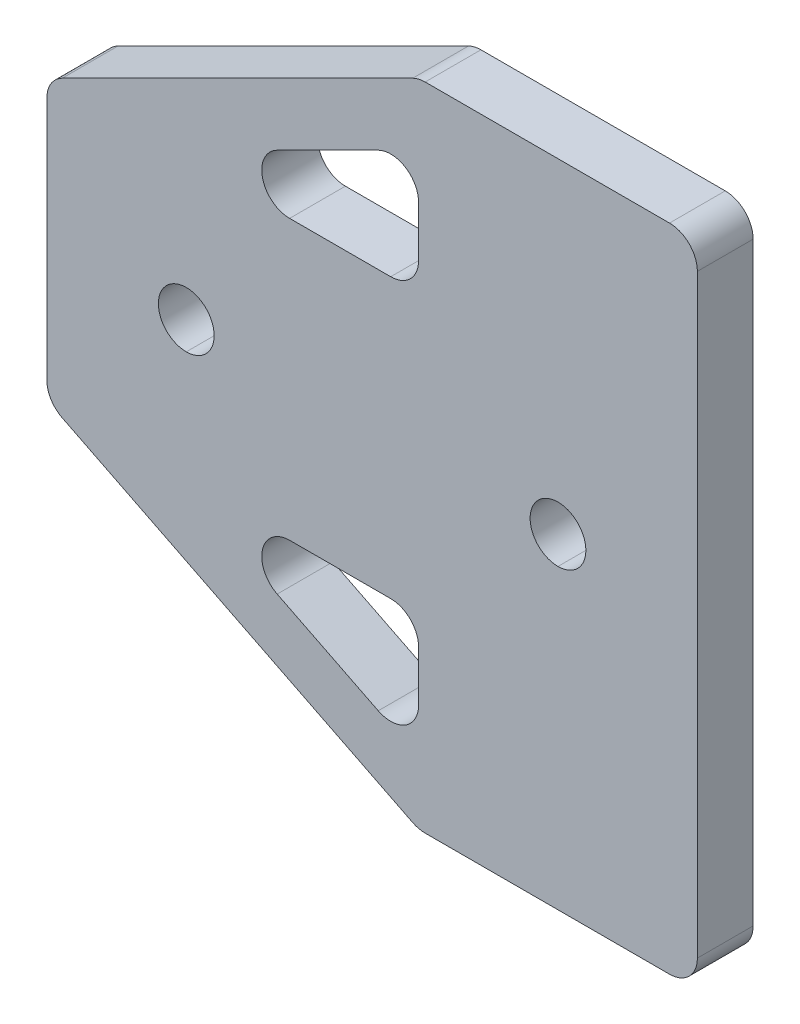
ISO-10303-21;
HEADER;
FILE_DESCRIPTION(('STEP AP214'),'2;1');
FILE_NAME('part.step','',(''),(''),'','','');
FILE_SCHEMA(('AUTOMOTIVE_DESIGN { 1 0 10303 214 1 1 1 1 }'));
ENDSEC;
DATA;
#1=APPLICATION_CONTEXT('core data for automotive mechanical design processes');
#2=APPLICATION_PROTOCOL_DEFINITION('international standard','automotive_design',2000,#1);
#3=PRODUCT_CONTEXT('',#1,'mechanical');
#4=PRODUCT('Part','Part','',(#3));
#5=PRODUCT_RELATED_PRODUCT_CATEGORY('part','',(#4));
#6=PRODUCT_DEFINITION_FORMATION('','',#4);
#7=PRODUCT_DEFINITION_CONTEXT('part definition',#1,'design');
#8=PRODUCT_DEFINITION('design','',#6,#7);
#9=PRODUCT_DEFINITION_SHAPE('','',#8);
#10=(LENGTH_UNIT() NAMED_UNIT(*) SI_UNIT(.MILLI.,.METRE.));
#11=(NAMED_UNIT(*) PLANE_ANGLE_UNIT() SI_UNIT($,.RADIAN.));
#12=(NAMED_UNIT(*) SI_UNIT($,.STERADIAN.) SOLID_ANGLE_UNIT());
#13=UNCERTAINTY_MEASURE_WITH_UNIT(LENGTH_MEASURE(1.E-05),#10,'distance_accuracy_value','');
#14=(GEOMETRIC_REPRESENTATION_CONTEXT(3) GLOBAL_UNCERTAINTY_ASSIGNED_CONTEXT((#13)) GLOBAL_UNIT_ASSIGNED_CONTEXT((#10,
#11,#12)) REPRESENTATION_CONTEXT('',''));
#15=CARTESIAN_POINT('',(0.,0.,0.));
#16=DIRECTION('',(0.,0.,1.));
#17=DIRECTION('',(1.,0.,0.));
#18=AXIS2_PLACEMENT_3D('',#15,#16,#17);
#19=CARTESIAN_POINT('',(-9.,-11.7188470506255,6.9108));
#20=DIRECTION('',(0.,0.,-1.));
#21=DIRECTION('',(1.,0.,0.));
#22=AXIS2_PLACEMENT_3D('',#19,#20,#21);
#23=CYLINDRICAL_SURFACE('',#22,1.5);
#24=CARTESIAN_POINT('',(-9.,-11.7188470506255,0.));
#25=DIRECTION('',(0.,0.,1.));
#26=DIRECTION('',(-0.447213595499957,-0.894427190999917,0.));
#27=AXIS2_PLACEMENT_3D('',#24,#25,#26);
#28=CIRCLE('',#27,1.5);
#29=CARTESIAN_POINT('',(-9.67082039324994,-13.0604878371254,0.));
#30=VERTEX_POINT('',#29);
#31=CARTESIAN_POINT('',(-7.5,-11.7188470506255,0.));
#32=VERTEX_POINT('',#31);
#33=EDGE_CURVE('E20',#30,#32,#28,.T.);
#34=ORIENTED_EDGE('',*,*,#33,.F.);
#35=DIRECTION('',(0.,0.,-1.));
#36=VECTOR('',#35,1.);
#37=CARTESIAN_POINT('',(-9.67082039324994,-13.0604878371253,3.));
#38=LINE('',#37,#36);
#39=CARTESIAN_POINT('',(-9.67082039324994,-13.0604878371254,3.));
#40=VERTEX_POINT('',#39);
#41=EDGE_CURVE('E11',#40,#30,#38,.T.);
#42=ORIENTED_EDGE('',*,*,#41,.F.);
#43=CARTESIAN_POINT('',(-9.,-11.7188470506255,3.));
#44=DIRECTION('',(0.,0.,-1.));
#45=DIRECTION('',(1.,0.,0.));
#46=AXIS2_PLACEMENT_3D('',#43,#44,#45);
#47=CIRCLE('',#46,1.5);
#48=CARTESIAN_POINT('',(-7.5,-11.7188470506255,3.));
#49=VERTEX_POINT('',#48);
#50=EDGE_CURVE('E334',#49,#40,#47,.T.);
#51=ORIENTED_EDGE('',*,*,#50,.F.);
#52=DIRECTION('',(0.,0.,-1.));
#53=VECTOR('',#52,1.);
#54=CARTESIAN_POINT('',(-7.5,-11.7188470506255,3.));
#55=LINE('',#54,#53);
#56=EDGE_CURVE('E379',#49,#32,#55,.T.);
#57=ORIENTED_EDGE('',*,*,#56,.T.);
#58=EDGE_LOOP('',(#34,#42,#51,#57));
#59=FACE_BOUND('',#58,.T.);
#60=ADVANCED_FACE('F17',(#59),#23,.F.);
#61=CARTESIAN_POINT('',(-20.7917960675006,-7.5,0.));
#62=DIRECTION('',(0.447213595499958,0.894427190999916,0.));
#63=DIRECTION('',(0.894427190999916,-0.447213595499958,0.));
#64=AXIS2_PLACEMENT_3D('',#61,#62,#63);
#65=PLANE('',#64);
#66=DIRECTION('',(0.894427190999916,-0.447213595499958,0.));
#67=VECTOR('',#66,1.);
#68=CARTESIAN_POINT('',(-15.1085144945009,-10.3416407864999,0.));
#69=LINE('',#68,#67);
#70=CARTESIAN_POINT('',(-15.1085144945009,-10.3416407864999,0.));
#71=VERTEX_POINT('',#70);
#72=EDGE_CURVE('E249',#71,#30,#69,.T.);
#73=ORIENTED_EDGE('',*,*,#72,.F.);
#74=DIRECTION('',(0.,0.,1.));
#75=VECTOR('',#74,1.);
#76=CARTESIAN_POINT('',(-15.1085144945009,-10.3416407864999,0.));
#77=LINE('',#76,#75);
#78=CARTESIAN_POINT('',(-15.1085144945009,-10.3416407864999,3.));
#79=VERTEX_POINT('',#78);
#80=EDGE_CURVE('E25',#71,#79,#77,.T.);
#81=ORIENTED_EDGE('',*,*,#80,.T.);
#82=DIRECTION('',(0.894427190999916,-0.447213595499958,0.));
#83=VECTOR('',#82,1.);
#84=CARTESIAN_POINT('',(-15.1085144945009,-10.3416407864999,3.));
#85=LINE('',#84,#83);
#86=EDGE_CURVE('E331',#79,#40,#85,.T.);
#87=ORIENTED_EDGE('',*,*,#86,.T.);
#88=ORIENTED_EDGE('',*,*,#41,.T.);
#89=EDGE_LOOP('',(#73,#81,#87,#88));
#90=FACE_BOUND('',#89,.T.);
#91=ADVANCED_FACE('F409',(#90),#65,.T.);
#92=CARTESIAN_POINT('',(-14.437694101251,-9.,-3.9108));
#93=DIRECTION('',(0.,0.,1.));
#94=DIRECTION('',(0.,1.,0.));
#95=AXIS2_PLACEMENT_3D('',#92,#93,#94);
#96=CYLINDRICAL_SURFACE('',#95,1.5);
#97=CARTESIAN_POINT('',(-14.437694101251,-9.,3.));
#98=DIRECTION('',(0.,0.,-1.));
#99=DIRECTION('',(-0.447213595499958,-0.894427190999916,0.));
#100=AXIS2_PLACEMENT_3D('',#97,#98,#99);
#101=CIRCLE('',#100,1.5);
#102=CARTESIAN_POINT('',(-14.437694101251,-7.5,3.));
#103=VERTEX_POINT('',#102);
#104=EDGE_CURVE('E330',#79,#103,#101,.T.);
#105=ORIENTED_EDGE('',*,*,#104,.F.);
#106=ORIENTED_EDGE('',*,*,#80,.F.);
#107=CARTESIAN_POINT('',(-14.437694101251,-9.,0.));
#108=DIRECTION('',(0.,0.,1.));
#109=DIRECTION('',(0.,1.,0.));
#110=AXIS2_PLACEMENT_3D('',#107,#108,#109);
#111=CIRCLE('',#110,1.5);
#112=CARTESIAN_POINT('',(-14.437694101251,-7.5,0.));
#113=VERTEX_POINT('',#112);
#114=EDGE_CURVE('E252',#113,#71,#111,.T.);
#115=ORIENTED_EDGE('',*,*,#114,.F.);
#116=DIRECTION('',(0.,0.,1.));
#117=VECTOR('',#116,1.);
#118=CARTESIAN_POINT('',(-14.437694101251,-7.5,0.));
#119=LINE('',#118,#117);
#120=EDGE_CURVE('E387',#113,#103,#119,.T.);
#121=ORIENTED_EDGE('',*,*,#120,.T.);
#122=EDGE_LOOP('',(#105,#106,#115,#121));
#123=FACE_BOUND('',#122,.T.);
#124=ADVANCED_FACE('F413',(#123),#96,.F.);
#125=CARTESIAN_POINT('',(-27.5,-7.5,0.));
#126=DIRECTION('',(0.,-1.,0.));
#127=DIRECTION('',(1.,0.,0.));
#128=AXIS2_PLACEMENT_3D('',#125,#126,#127);
#129=PLANE('',#128);
#130=DIRECTION('',(1.,0.,0.));
#131=VECTOR('',#130,1.);
#132=CARTESIAN_POINT('',(-14.437694101251,-7.5,3.));
#133=LINE('',#132,#131);
#134=CARTESIAN_POINT('',(-9.,-7.5,3.));
#135=VERTEX_POINT('',#134);
#136=EDGE_CURVE('E327',#103,#135,#133,.T.);
#137=ORIENTED_EDGE('',*,*,#136,.F.);
#138=ORIENTED_EDGE('',*,*,#120,.F.);
#139=DIRECTION('',(1.,0.,0.));
#140=VECTOR('',#139,1.);
#141=CARTESIAN_POINT('',(-14.437694101251,-7.5,0.));
#142=LINE('',#141,#140);
#143=CARTESIAN_POINT('',(-9.,-7.5,0.));
#144=VERTEX_POINT('',#143);
#145=EDGE_CURVE('E243',#113,#144,#142,.T.);
#146=ORIENTED_EDGE('',*,*,#145,.T.);
#147=DIRECTION('',(0.,0.,1.));
#148=VECTOR('',#147,1.);
#149=CARTESIAN_POINT('',(-9.,-7.5,0.));
#150=LINE('',#149,#148);
#151=EDGE_CURVE('E381',#144,#135,#150,.T.);
#152=ORIENTED_EDGE('',*,*,#151,.T.);
#153=EDGE_LOOP('',(#137,#138,#146,#152));
#154=FACE_BOUND('',#153,.T.);
#155=ADVANCED_FACE('F418',(#154),#129,.T.);
#156=CARTESIAN_POINT('',(-9.,-9.,-3.9108));
#157=DIRECTION('',(0.,0.,1.));
#158=DIRECTION('',(1.,0.,0.));
#159=AXIS2_PLACEMENT_3D('',#156,#157,#158);
#160=CYLINDRICAL_SURFACE('',#159,1.5);
#161=CARTESIAN_POINT('',(-9.,-9.,3.));
#162=DIRECTION('',(0.,0.,-1.));
#163=DIRECTION('',(0.,1.,0.));
#164=AXIS2_PLACEMENT_3D('',#161,#162,#163);
#165=CIRCLE('',#164,1.5);
#166=CARTESIAN_POINT('',(-7.5,-9.,3.));
#167=VERTEX_POINT('',#166);
#168=EDGE_CURVE('E326',#135,#167,#165,.T.);
#169=ORIENTED_EDGE('',*,*,#168,.F.);
#170=ORIENTED_EDGE('',*,*,#151,.F.);
#171=CARTESIAN_POINT('',(-9.,-9.,0.));
#172=DIRECTION('',(0.,0.,1.));
#173=DIRECTION('',(1.,0.,0.));
#174=AXIS2_PLACEMENT_3D('',#171,#172,#173);
#175=CIRCLE('',#174,1.5);
#176=CARTESIAN_POINT('',(-7.5,-9.,0.));
#177=VERTEX_POINT('',#176);
#178=EDGE_CURVE('E245',#177,#144,#175,.T.);
#179=ORIENTED_EDGE('',*,*,#178,.F.);
#180=DIRECTION('',(0.,0.,1.));
#181=VECTOR('',#180,1.);
#182=CARTESIAN_POINT('',(-7.5,-9.,0.));
#183=LINE('',#182,#181);
#184=EDGE_CURVE('E373',#177,#167,#183,.T.);
#185=ORIENTED_EDGE('',*,*,#184,.T.);
#186=EDGE_LOOP('',(#169,#170,#179,#185));
#187=FACE_BOUND('',#186,.T.);
#188=ADVANCED_FACE('F422',(#187),#160,.F.);
#189=CARTESIAN_POINT('',(-7.5,-7.5,0.));
#190=DIRECTION('',(-1.,0.,0.));
#191=DIRECTION('',(0.,-1.,0.));
#192=AXIS2_PLACEMENT_3D('',#189,#190,#191);
#193=PLANE('',#192);
#194=DIRECTION('',(0.,-1.,0.));
#195=VECTOR('',#194,1.);
#196=CARTESIAN_POINT('',(-7.5,-9.,0.));
#197=LINE('',#196,#195);
#198=EDGE_CURVE('E246',#177,#32,#197,.T.);
#199=ORIENTED_EDGE('',*,*,#198,.T.);
#200=ORIENTED_EDGE('',*,*,#56,.F.);
#201=DIRECTION('',(0.,-1.,0.));
#202=VECTOR('',#201,1.);
#203=CARTESIAN_POINT('',(-7.5,-9.,3.));
#204=LINE('',#203,#202);
#205=EDGE_CURVE('E323',#167,#49,#204,.T.);
#206=ORIENTED_EDGE('',*,*,#205,.F.);
#207=ORIENTED_EDGE('',*,*,#184,.F.);
#208=EDGE_LOOP('',(#199,#200,#206,#207));
#209=FACE_BOUND('',#208,.T.);
#210=ADVANCED_FACE('F402',(#209),#193,.T.);
#211=CARTESIAN_POINT('',(-9.,11.7188470506255,-3.9108));
#212=DIRECTION('',(0.,0.,1.));
#213=DIRECTION('',(1.,0.,0.));
#214=AXIS2_PLACEMENT_3D('',#211,#212,#213);
#215=CYLINDRICAL_SURFACE('',#214,1.5);
#216=CARTESIAN_POINT('',(-9.,11.7188470506255,3.));
#217=DIRECTION('',(0.,0.,-1.));
#218=DIRECTION('',(-0.447213595499957,0.894427190999916,0.));
#219=AXIS2_PLACEMENT_3D('',#216,#217,#218);
#220=CIRCLE('',#219,1.5);
#221=CARTESIAN_POINT('',(-9.67082039324994,13.0604878371254,3.));
#222=VERTEX_POINT('',#221);
#223=CARTESIAN_POINT('',(-7.5,11.7188470506255,3.));
#224=VERTEX_POINT('',#223);
#225=EDGE_CURVE('E322',#222,#224,#220,.T.);
#226=ORIENTED_EDGE('',*,*,#225,.F.);
#227=DIRECTION('',(0.,0.,1.));
#228=VECTOR('',#227,1.);
#229=CARTESIAN_POINT('',(-9.67082039324994,13.0604878371254,0.));
#230=LINE('',#229,#228);
#231=CARTESIAN_POINT('',(-9.67082039324994,13.0604878371254,0.));
#232=VERTEX_POINT('',#231);
#233=EDGE_CURVE('E353',#232,#222,#230,.T.);
#234=ORIENTED_EDGE('',*,*,#233,.F.);
#235=CARTESIAN_POINT('',(-9.,11.7188470506255,0.));
#236=DIRECTION('',(0.,0.,1.));
#237=DIRECTION('',(1.,0.,0.));
#238=AXIS2_PLACEMENT_3D('',#235,#236,#237);
#239=CIRCLE('',#238,1.5);
#240=CARTESIAN_POINT('',(-7.5,11.7188470506255,0.));
#241=VERTEX_POINT('',#240);
#242=EDGE_CURVE('E239',#241,#232,#239,.T.);
#243=ORIENTED_EDGE('',*,*,#242,.F.);
#244=DIRECTION('',(0.,0.,1.));
#245=VECTOR('',#244,1.);
#246=CARTESIAN_POINT('',(-7.5,11.7188470506255,0.));
#247=LINE('',#246,#245);
#248=EDGE_CURVE('E371',#241,#224,#247,.T.);
#249=ORIENTED_EDGE('',*,*,#248,.T.);
#250=EDGE_LOOP('',(#226,#234,#243,#249));
#251=FACE_BOUND('',#250,.T.);
#252=ADVANCED_FACE('F430',(#251),#215,.F.);
#253=CARTESIAN_POINT('',(-7.5,17.5,0.));
#254=DIRECTION('',(-1.,0.,0.));
#255=DIRECTION('',(0.,-1.,0.));
#256=AXIS2_PLACEMENT_3D('',#253,#254,#255);
#257=PLANE('',#256);
#258=DIRECTION('',(0.,-1.,0.));
#259=VECTOR('',#258,1.);
#260=CARTESIAN_POINT('',(-7.5,11.7188470506255,3.));
#261=LINE('',#260,#259);
#262=CARTESIAN_POINT('',(-7.5,9.,3.));
#263=VERTEX_POINT('',#262);
#264=EDGE_CURVE('E319',#224,#263,#261,.T.);
#265=ORIENTED_EDGE('',*,*,#264,.F.);
#266=ORIENTED_EDGE('',*,*,#248,.F.);
#267=DIRECTION('',(0.,-1.,0.));
#268=VECTOR('',#267,1.);
#269=CARTESIAN_POINT('',(-7.5,11.7188470506255,0.));
#270=LINE('',#269,#268);
#271=CARTESIAN_POINT('',(-7.5,9.,0.));
#272=VERTEX_POINT('',#271);
#273=EDGE_CURVE('E240',#241,#272,#270,.T.);
#274=ORIENTED_EDGE('',*,*,#273,.T.);
#275=DIRECTION('',(0.,0.,1.));
#276=VECTOR('',#275,1.);
#277=CARTESIAN_POINT('',(-7.5,9.,0.));
#278=LINE('',#277,#276);
#279=EDGE_CURVE('E363',#272,#263,#278,.T.);
#280=ORIENTED_EDGE('',*,*,#279,.T.);
#281=EDGE_LOOP('',(#265,#266,#274,#280));
#282=FACE_BOUND('',#281,.T.);
#283=ADVANCED_FACE('F474',(#282),#257,.T.);
#284=CARTESIAN_POINT('',(-9.,9.,-3.9108));
#285=DIRECTION('',(0.,0.,1.));
#286=DIRECTION('',(0.,-1.,0.));
#287=AXIS2_PLACEMENT_3D('',#284,#285,#286);
#288=CYLINDRICAL_SURFACE('',#287,1.5);
#289=CARTESIAN_POINT('',(-9.,9.,3.));
#290=DIRECTION('',(0.,0.,-1.));
#291=DIRECTION('',(1.,0.,0.));
#292=AXIS2_PLACEMENT_3D('',#289,#290,#291);
#293=CIRCLE('',#292,1.5);
#294=CARTESIAN_POINT('',(-9.,7.5,3.));
#295=VERTEX_POINT('',#294);
#296=EDGE_CURVE('E318',#263,#295,#293,.T.);
#297=ORIENTED_EDGE('',*,*,#296,.F.);
#298=ORIENTED_EDGE('',*,*,#279,.F.);
#299=CARTESIAN_POINT('',(-9.,9.,0.));
#300=DIRECTION('',(0.,0.,1.));
#301=DIRECTION('',(0.,-1.,0.));
#302=AXIS2_PLACEMENT_3D('',#299,#300,#301);
#303=CIRCLE('',#302,1.5);
#304=CARTESIAN_POINT('',(-9.,7.5,0.));
#305=VERTEX_POINT('',#304);
#306=EDGE_CURVE('E242',#305,#272,#303,.T.);
#307=ORIENTED_EDGE('',*,*,#306,.F.);
#308=DIRECTION('',(0.,0.,1.));
#309=VECTOR('',#308,1.);
#310=CARTESIAN_POINT('',(-9.,7.5,0.));
#311=LINE('',#310,#309);
#312=EDGE_CURVE('E361',#305,#295,#311,.T.);
#313=ORIENTED_EDGE('',*,*,#312,.T.);
#314=EDGE_LOOP('',(#297,#298,#307,#313));
#315=FACE_BOUND('',#314,.T.);
#316=ADVANCED_FACE('F485',(#315),#288,.F.);
#317=CARTESIAN_POINT('',(-7.5,7.5,0.));
#318=DIRECTION('',(0.,1.,0.));
#319=DIRECTION('',(-1.,0.,0.));
#320=AXIS2_PLACEMENT_3D('',#317,#318,#319);
#321=PLANE('',#320);
#322=DIRECTION('',(-1.,0.,0.));
#323=VECTOR('',#322,1.);
#324=CARTESIAN_POINT('',(-9.,7.5,0.));
#325=LINE('',#324,#323);
#326=CARTESIAN_POINT('',(-14.437694101251,7.5,0.));
#327=VERTEX_POINT('',#326);
#328=EDGE_CURVE('E233',#305,#327,#325,.T.);
#329=ORIENTED_EDGE('',*,*,#328,.T.);
#330=DIRECTION('',(0.,0.,-1.));
#331=VECTOR('',#330,1.);
#332=CARTESIAN_POINT('',(-14.437694101251,7.5,3.));
#333=LINE('',#332,#331);
#334=CARTESIAN_POINT('',(-14.437694101251,7.5,3.));
#335=VERTEX_POINT('',#334);
#336=EDGE_CURVE('E356',#335,#327,#333,.T.);
#337=ORIENTED_EDGE('',*,*,#336,.F.);
#338=DIRECTION('',(-1.,0.,0.));
#339=VECTOR('',#338,1.);
#340=CARTESIAN_POINT('',(-9.,7.5,3.));
#341=LINE('',#340,#339);
#342=EDGE_CURVE('E315',#295,#335,#341,.T.);
#343=ORIENTED_EDGE('',*,*,#342,.F.);
#344=ORIENTED_EDGE('',*,*,#312,.F.);
#345=EDGE_LOOP('',(#329,#337,#343,#344));
#346=FACE_BOUND('',#345,.T.);
#347=ADVANCED_FACE('F496',(#346),#321,.T.);
#348=CARTESIAN_POINT('',(-14.437694101251,9.,6.9108));
#349=DIRECTION('',(0.,0.,-1.));
#350=DIRECTION('',(0.,-1.,0.));
#351=AXIS2_PLACEMENT_3D('',#348,#349,#350);
#352=CYLINDRICAL_SURFACE('',#351,1.5);
#353=CARTESIAN_POINT('',(-14.437694101251,9.,0.));
#354=DIRECTION('',(0.,0.,1.));
#355=DIRECTION('',(-0.447213595499959,0.894427190999915,0.));
#356=AXIS2_PLACEMENT_3D('',#353,#354,#355);
#357=CIRCLE('',#356,1.5);
#358=CARTESIAN_POINT('',(-15.1085144945009,10.3416407864999,0.));
#359=VERTEX_POINT('',#358);
#360=EDGE_CURVE('E235',#359,#327,#357,.T.);
#361=ORIENTED_EDGE('',*,*,#360,.F.);
#362=DIRECTION('',(0.,0.,-1.));
#363=VECTOR('',#362,1.);
#364=CARTESIAN_POINT('',(-15.1085144945009,10.3416407864999,3.));
#365=LINE('',#364,#363);
#366=CARTESIAN_POINT('',(-15.1085144945009,10.3416407864999,3.));
#367=VERTEX_POINT('',#366);
#368=EDGE_CURVE('E350',#367,#359,#365,.T.);
#369=ORIENTED_EDGE('',*,*,#368,.F.);
#370=CARTESIAN_POINT('',(-14.437694101251,9.,3.));
#371=DIRECTION('',(0.,0.,-1.));
#372=DIRECTION('',(0.,-1.,0.));
#373=AXIS2_PLACEMENT_3D('',#370,#371,#372);
#374=CIRCLE('',#373,1.5);
#375=EDGE_CURVE('E314',#335,#367,#374,.T.);
#376=ORIENTED_EDGE('',*,*,#375,.F.);
#377=ORIENTED_EDGE('',*,*,#336,.T.);
#378=EDGE_LOOP('',(#361,#369,#376,#377));
#379=FACE_BOUND('',#378,.T.);
#380=ADVANCED_FACE('F507',(#379),#352,.F.);
#381=CARTESIAN_POINT('',(-7.5,14.1458980337503,0.));
#382=DIRECTION('',(0.447213595499958,-0.894427190999916,0.));
#383=DIRECTION('',(-0.894427190999916,-0.447213595499958,0.));
#384=AXIS2_PLACEMENT_3D('',#381,#382,#383);
#385=PLANE('',#384);
#386=DIRECTION('',(-0.894427190999916,-0.447213595499958,0.));
#387=VECTOR('',#386,1.);
#388=CARTESIAN_POINT('',(-9.67082039324994,13.0604878371254,0.));
#389=LINE('',#388,#387);
#390=EDGE_CURVE('E236',#232,#359,#389,.T.);
#391=ORIENTED_EDGE('',*,*,#390,.F.);
#392=ORIENTED_EDGE('',*,*,#233,.T.);
#393=DIRECTION('',(-0.894427190999916,-0.447213595499958,0.));
#394=VECTOR('',#393,1.);
#395=CARTESIAN_POINT('',(-9.67082039324994,13.0604878371254,3.));
#396=LINE('',#395,#394);
#397=EDGE_CURVE('E311',#222,#367,#396,.T.);
#398=ORIENTED_EDGE('',*,*,#397,.T.);
#399=ORIENTED_EDGE('',*,*,#368,.T.);
#400=EDGE_LOOP('',(#391,#392,#398,#399));
#401=FACE_BOUND('',#400,.T.);
#402=ADVANCED_FACE('F518',(#401),#385,.T.);
#403=CARTESIAN_POINT('',(0.,0.,0.));
#404=DIRECTION('',(0.,0.,-1.));
#405=DIRECTION('',(0.,-1.,0.));
#406=AXIS2_PLACEMENT_3D('',#403,#404,#405);
#407=CYLINDRICAL_SURFACE('',#406,1.5);
#408=DIRECTION('',(0.,0.,1.));
#409=VECTOR('',#408,1.);
#410=CARTESIAN_POINT('',(0.,-1.5,0.));
#411=LINE('',#410,#409);
#412=CARTESIAN_POINT('',(0.,-1.5,0.));
#413=VERTEX_POINT('',#412);
#414=CARTESIAN_POINT('',(0.,-1.5,3.));
#415=VERTEX_POINT('',#414);
#416=EDGE_CURVE('E38',#413,#415,#411,.T.);
#417=ORIENTED_EDGE('',*,*,#416,.T.);
#418=CARTESIAN_POINT('',(0.,0.,3.));
#419=DIRECTION('',(0.,0.,-1.));
#420=DIRECTION('',(0.,1.,0.));
#421=AXIS2_PLACEMENT_3D('',#418,#419,#420);
#422=CIRCLE('',#421,1.5);
#423=CARTESIAN_POINT('',(0.,1.5,3.));
#424=VERTEX_POINT('',#423);
#425=EDGE_CURVE('E33',#424,#415,#422,.T.);
#426=ORIENTED_EDGE('',*,*,#425,.F.);
#427=DIRECTION('',(0.,0.,1.));
#428=VECTOR('',#427,1.);
#429=CARTESIAN_POINT('',(0.,1.5,0.));
#430=LINE('',#429,#428);
#431=CARTESIAN_POINT('',(0.,1.5,0.));
#432=VERTEX_POINT('',#431);
#433=EDGE_CURVE('E348',#432,#424,#430,.T.);
#434=ORIENTED_EDGE('',*,*,#433,.F.);
#435=CARTESIAN_POINT('',(0.,0.,0.));
#436=DIRECTION('',(0.,0.,-1.));
#437=DIRECTION('',(0.,1.,0.));
#438=AXIS2_PLACEMENT_3D('',#435,#436,#437);
#439=CIRCLE('',#438,1.5);
#440=EDGE_CURVE('E231',#432,#413,#439,.T.);
#441=ORIENTED_EDGE('',*,*,#440,.T.);
#442=EDGE_LOOP('',(#417,#426,#434,#441));
#443=FACE_BOUND('',#442,.T.);
#444=ADVANCED_FACE('F529',(#443),#407,.F.);
#445=CARTESIAN_POINT('',(0.,0.,0.));
#446=DIRECTION('',(0.,0.,-1.));
#447=DIRECTION('',(0.,-1.,0.));
#448=AXIS2_PLACEMENT_3D('',#445,#446,#447);
#449=CYLINDRICAL_SURFACE('',#448,1.5);
#450=ORIENTED_EDGE('',*,*,#433,.T.);
#451=CARTESIAN_POINT('',(0.,0.,3.));
#452=DIRECTION('',(0.,0.,-1.));
#453=DIRECTION('',(0.,-1.,0.));
#454=AXIS2_PLACEMENT_3D('',#451,#452,#453);
#455=CIRCLE('',#454,1.5);
#456=EDGE_CURVE('E307',#415,#424,#455,.T.);
#457=ORIENTED_EDGE('',*,*,#456,.F.);
#458=ORIENTED_EDGE('',*,*,#416,.F.);
#459=CARTESIAN_POINT('',(0.,0.,0.));
#460=DIRECTION('',(0.,0.,-1.));
#461=DIRECTION('',(0.,-1.,0.));
#462=AXIS2_PLACEMENT_3D('',#459,#460,#461);
#463=CIRCLE('',#462,1.5);
#464=EDGE_CURVE('E211',#413,#432,#463,.T.);
#465=ORIENTED_EDGE('',*,*,#464,.T.);
#466=EDGE_LOOP('',(#450,#457,#458,#465));
#467=FACE_BOUND('',#466,.T.);
#468=ADVANCED_FACE('F540',(#467),#449,.F.);
#469=CARTESIAN_POINT('',(-20.,0.,0.));
#470=DIRECTION('',(0.,0.,-1.));
#471=DIRECTION('',(0.,-1.,0.));
#472=AXIS2_PLACEMENT_3D('',#469,#470,#471);
#473=CYLINDRICAL_SURFACE('',#472,1.5);
#474=DIRECTION('',(0.,0.,1.));
#475=VECTOR('',#474,1.);
#476=CARTESIAN_POINT('',(-20.,-1.5,0.));
#477=LINE('',#476,#475);
#478=CARTESIAN_POINT('',(-20.,-1.5,0.));
#479=VERTEX_POINT('',#478);
#480=CARTESIAN_POINT('',(-20.,-1.5,3.));
#481=VERTEX_POINT('',#480);
#482=EDGE_CURVE('E204',#479,#481,#477,.T.);
#483=ORIENTED_EDGE('',*,*,#482,.T.);
#484=CARTESIAN_POINT('',(-20.,0.,3.));
#485=DIRECTION('',(0.,0.,-1.));
#486=DIRECTION('',(0.,1.,0.));
#487=AXIS2_PLACEMENT_3D('',#484,#485,#486);
#488=CIRCLE('',#487,1.5);
#489=CARTESIAN_POINT('',(-20.,1.5,3.));
#490=VERTEX_POINT('',#489);
#491=EDGE_CURVE('E305',#490,#481,#488,.T.);
#492=ORIENTED_EDGE('',*,*,#491,.F.);
#493=DIRECTION('',(0.,0.,1.));
#494=VECTOR('',#493,1.);
#495=CARTESIAN_POINT('',(-20.,1.5,0.));
#496=LINE('',#495,#494);
#497=CARTESIAN_POINT('',(-20.,1.5,0.));
#498=VERTEX_POINT('',#497);
#499=EDGE_CURVE('E207',#498,#490,#496,.T.);
#500=ORIENTED_EDGE('',*,*,#499,.F.);
#501=CARTESIAN_POINT('',(-20.,0.,0.));
#502=DIRECTION('',(0.,0.,-1.));
#503=DIRECTION('',(0.,1.,0.));
#504=AXIS2_PLACEMENT_3D('',#501,#502,#503);
#505=CIRCLE('',#504,1.5);
#506=EDGE_CURVE('E201',#498,#479,#505,.T.);
#507=ORIENTED_EDGE('',*,*,#506,.T.);
#508=EDGE_LOOP('',(#483,#492,#500,#507));
#509=FACE_BOUND('',#508,.T.);
#510=ADVANCED_FACE('F203',(#509),#473,.F.);
#511=CARTESIAN_POINT('',(-20.,0.,0.));
#512=DIRECTION('',(0.,0.,-1.));
#513=DIRECTION('',(0.,-1.,0.));
#514=AXIS2_PLACEMENT_3D('',#511,#512,#513);
#515=CYLINDRICAL_SURFACE('',#514,1.5);
#516=ORIENTED_EDGE('',*,*,#499,.T.);
#517=CARTESIAN_POINT('',(-20.,0.,3.));
#518=DIRECTION('',(0.,0.,-1.));
#519=DIRECTION('',(0.,-1.,0.));
#520=AXIS2_PLACEMENT_3D('',#517,#518,#519);
#521=CIRCLE('',#520,1.5);
#522=EDGE_CURVE('E217',#481,#490,#521,.T.);
#523=ORIENTED_EDGE('',*,*,#522,.F.);
#524=ORIENTED_EDGE('',*,*,#482,.F.);
#525=CARTESIAN_POINT('',(-20.,0.,0.));
#526=DIRECTION('',(0.,0.,-1.));
#527=DIRECTION('',(0.,-1.,0.));
#528=AXIS2_PLACEMENT_3D('',#525,#526,#527);
#529=CIRCLE('',#528,1.5);
#530=EDGE_CURVE('E212',#479,#498,#529,.T.);
#531=ORIENTED_EDGE('',*,*,#530,.T.);
#532=EDGE_LOOP('',(#516,#523,#524,#531));
#533=FACE_BOUND('',#532,.T.);
#534=ADVANCED_FACE('F215',(#533),#515,.F.);
#535=CARTESIAN_POINT('',(7.5,17.5,0.));
#536=DIRECTION('',(0.,1.,0.));
#537=DIRECTION('',(-1.,0.,0.));
#538=AXIS2_PLACEMENT_3D('',#535,#536,#537);
#539=PLANE('',#538);
#540=DIRECTION('',(-1.,0.,0.));
#541=VECTOR('',#540,1.);
#542=CARTESIAN_POINT('',(6.,17.5,0.));
#543=LINE('',#542,#541);
#544=CARTESIAN_POINT('',(6.,17.5,0.));
#545=VERTEX_POINT('',#544);
#546=CARTESIAN_POINT('',(-7.14589803375032,17.5,0.));
#547=VERTEX_POINT('',#546);
#548=EDGE_CURVE('E807',#545,#547,#543,.T.);
#549=ORIENTED_EDGE('',*,*,#548,.T.);
#550=DIRECTION('',(0.,0.,1.));
#551=VECTOR('',#550,1.);
#552=CARTESIAN_POINT('',(-7.14589803375032,17.5,0.));
#553=LINE('',#552,#551);
#554=CARTESIAN_POINT('',(-7.14589803375032,17.5,3.));
#555=VERTEX_POINT('',#554);
#556=EDGE_CURVE('E219',#547,#555,#553,.T.);
#557=ORIENTED_EDGE('',*,*,#556,.T.);
#558=DIRECTION('',(-1.,0.,0.));
#559=VECTOR('',#558,1.);
#560=CARTESIAN_POINT('',(6.,17.5,3.));
#561=LINE('',#560,#559);
#562=CARTESIAN_POINT('',(6.,17.5,3.));
#563=VERTEX_POINT('',#562);
#564=EDGE_CURVE('E301',#563,#555,#561,.T.);
#565=ORIENTED_EDGE('',*,*,#564,.F.);
#566=DIRECTION('',(0.,0.,-1.));
#567=VECTOR('',#566,1.);
#568=CARTESIAN_POINT('',(6.,17.5,3.));
#569=LINE('',#568,#567);
#570=EDGE_CURVE('E261',#563,#545,#569,.T.);
#571=ORIENTED_EDGE('',*,*,#570,.T.);
#572=EDGE_LOOP('',(#549,#557,#565,#571));
#573=FACE_BOUND('',#572,.T.);
#574=ADVANCED_FACE('F569',(#573),#539,.T.);
#575=CARTESIAN_POINT('',(-7.14589803375032,16.,-3.9108));
#576=DIRECTION('',(0.,0.,1.));
#577=DIRECTION('',(0.,1.,0.));
#578=AXIS2_PLACEMENT_3D('',#575,#576,#577);
#579=CYLINDRICAL_SURFACE('',#578,1.5);
#580=ORIENTED_EDGE('',*,*,#556,.F.);
#581=CARTESIAN_POINT('',(-7.14589803375032,16.,0.));
#582=DIRECTION('',(0.,0.,-1.));
#583=DIRECTION('',(-0.447213595499956,0.894427190999917,0.));
#584=AXIS2_PLACEMENT_3D('',#581,#582,#583);
#585=CIRCLE('',#584,1.5);
#586=CARTESIAN_POINT('',(-7.81671842700026,17.3416407864999,0.));
#587=VERTEX_POINT('',#586);
#588=EDGE_CURVE('E819',#587,#547,#585,.T.);
#589=ORIENTED_EDGE('',*,*,#588,.F.);
#590=DIRECTION('',(0.,0.,1.));
#591=VECTOR('',#590,1.);
#592=CARTESIAN_POINT('',(-7.81671842700026,17.3416407864999,0.));
#593=LINE('',#592,#591);
#594=CARTESIAN_POINT('',(-7.81671842700026,17.3416407864999,3.));
#595=VERTEX_POINT('',#594);
#596=EDGE_CURVE('E342',#587,#595,#593,.T.);
#597=ORIENTED_EDGE('',*,*,#596,.T.);
#598=CARTESIAN_POINT('',(-7.14589803375032,16.,3.));
#599=DIRECTION('',(0.,0.,1.));
#600=DIRECTION('',(0.,1.,0.));
#601=AXIS2_PLACEMENT_3D('',#598,#599,#600);
#602=CIRCLE('',#601,1.5);
#603=EDGE_CURVE('E298',#555,#595,#602,.T.);
#604=ORIENTED_EDGE('',*,*,#603,.F.);
#605=EDGE_LOOP('',(#580,#589,#597,#604));
#606=FACE_BOUND('',#605,.T.);
#607=ADVANCED_FACE('F579',(#606),#579,.T.);
#608=CARTESIAN_POINT('',(-27.5,7.5,0.));
#609=DIRECTION('',(-0.447213595499958,0.894427190999916,0.));
#610=DIRECTION('',(0.894427190999916,0.447213595499958,0.));
#611=AXIS2_PLACEMENT_3D('',#608,#609,#610);
#612=PLANE('',#611);
#613=DIRECTION('',(0.894427190999916,0.447213595499958,0.));
#614=VECTOR('',#613,1.);
#615=CARTESIAN_POINT('',(-26.6708203932499,7.91458980337503,3.));
#616=LINE('',#615,#614);
#617=CARTESIAN_POINT('',(-26.6708203932499,7.91458980337503,3.));
#618=VERTEX_POINT('',#617);
#619=EDGE_CURVE('E295',#618,#595,#616,.T.);
#620=ORIENTED_EDGE('',*,*,#619,.T.);
#621=ORIENTED_EDGE('',*,*,#596,.F.);
#622=DIRECTION('',(0.894427190999916,0.447213595499958,0.));
#623=VECTOR('',#622,1.);
#624=CARTESIAN_POINT('',(-26.6708203932499,7.91458980337503,0.));
#625=LINE('',#624,#623);
#626=CARTESIAN_POINT('',(-26.6708203932499,7.91458980337503,0.));
#627=VERTEX_POINT('',#626);
#628=EDGE_CURVE('E823',#627,#587,#625,.T.);
#629=ORIENTED_EDGE('',*,*,#628,.F.);
#630=DIRECTION('',(0.,0.,-1.));
#631=VECTOR('',#630,1.);
#632=CARTESIAN_POINT('',(-26.6708203932499,7.91458980337503,3.));
#633=LINE('',#632,#631);
#634=EDGE_CURVE('E338',#618,#627,#633,.T.);
#635=ORIENTED_EDGE('',*,*,#634,.F.);
#636=EDGE_LOOP('',(#620,#621,#629,#635));
#637=FACE_BOUND('',#636,.T.);
#638=ADVANCED_FACE('F590',(#637),#612,.T.);
#639=CARTESIAN_POINT('',(-26.,6.57294901687516,6.9108));
#640=DIRECTION('',(0.,0.,-1.));
#641=DIRECTION('',(-1.,0.,0.));
#642=AXIS2_PLACEMENT_3D('',#639,#640,#641);
#643=CYLINDRICAL_SURFACE('',#642,1.5);
#644=DIRECTION('',(0.,0.,-1.));
#645=VECTOR('',#644,1.);
#646=CARTESIAN_POINT('',(-27.5,6.57294901687516,3.));
#647=LINE('',#646,#645);
#648=CARTESIAN_POINT('',(-27.5,6.57294901687516,3.));
#649=VERTEX_POINT('',#648);
#650=CARTESIAN_POINT('',(-27.5,6.57294901687516,0.));
#651=VERTEX_POINT('',#650);
#652=EDGE_CURVE('E335',#649,#651,#647,.T.);
#653=ORIENTED_EDGE('',*,*,#652,.F.);
#654=CARTESIAN_POINT('',(-26.,6.57294901687516,3.));
#655=DIRECTION('',(0.,0.,1.));
#656=DIRECTION('',(-0.447213595499959,0.894427190999915,0.));
#657=AXIS2_PLACEMENT_3D('',#654,#655,#656);
#658=CIRCLE('',#657,1.5);
#659=EDGE_CURVE('E292',#618,#649,#658,.T.);
#660=ORIENTED_EDGE('',*,*,#659,.F.);
#661=ORIENTED_EDGE('',*,*,#634,.T.);
#662=CARTESIAN_POINT('',(-26.,6.57294901687516,0.));
#663=DIRECTION('',(0.,0.,-1.));
#664=DIRECTION('',(-1.,0.,0.));
#665=AXIS2_PLACEMENT_3D('',#662,#663,#664);
#666=CIRCLE('',#665,1.5);
#667=EDGE_CURVE('E826',#651,#627,#666,.T.);
#668=ORIENTED_EDGE('',*,*,#667,.F.);
#669=EDGE_LOOP('',(#653,#660,#661,#668));
#670=FACE_BOUND('',#669,.T.);
#671=ADVANCED_FACE('F601',(#670),#643,.T.);
#672=CARTESIAN_POINT('',(-27.5,7.5,0.));
#673=DIRECTION('',(-1.,0.,0.));
#674=DIRECTION('',(0.,-1.,0.));
#675=AXIS2_PLACEMENT_3D('',#672,#673,#674);
#676=PLANE('',#675);
#677=DIRECTION('',(0.,-1.,0.));
#678=VECTOR('',#677,1.);
#679=CARTESIAN_POINT('',(-27.5,6.57294901687516,0.));
#680=LINE('',#679,#678);
#681=CARTESIAN_POINT('',(-27.5,-6.57294901687516,0.));
#682=VERTEX_POINT('',#681);
#683=EDGE_CURVE('E829',#651,#682,#680,.T.);
#684=ORIENTED_EDGE('',*,*,#683,.T.);
#685=DIRECTION('',(0.,0.,1.));
#686=VECTOR('',#685,1.);
#687=CARTESIAN_POINT('',(-27.5,-6.57294901687516,0.));
#688=LINE('',#687,#686);
#689=CARTESIAN_POINT('',(-27.5,-6.57294901687516,3.));
#690=VERTEX_POINT('',#689);
#691=EDGE_CURVE('E288',#682,#690,#688,.T.);
#692=ORIENTED_EDGE('',*,*,#691,.T.);
#693=DIRECTION('',(0.,-1.,0.));
#694=VECTOR('',#693,1.);
#695=CARTESIAN_POINT('',(-27.5,6.57294901687516,3.));
#696=LINE('',#695,#694);
#697=EDGE_CURVE('E289',#649,#690,#696,.T.);
#698=ORIENTED_EDGE('',*,*,#697,.F.);
#699=ORIENTED_EDGE('',*,*,#652,.T.);
#700=EDGE_LOOP('',(#684,#692,#698,#699));
#701=FACE_BOUND('',#700,.T.);
#702=ADVANCED_FACE('F612',(#701),#676,.T.);
#703=CARTESIAN_POINT('',(0.,0.,3.));
#704=DIRECTION('',(0.,0.,1.));
#705=DIRECTION('',(0.,1.,0.));
#706=AXIS2_PLACEMENT_3D('',#703,#704,#705);
#707=PLANE('',#706);
#708=ORIENTED_EDGE('',*,*,#50,.T.);
#709=ORIENTED_EDGE('',*,*,#86,.F.);
#710=ORIENTED_EDGE('',*,*,#104,.T.);
#711=ORIENTED_EDGE('',*,*,#136,.T.);
#712=ORIENTED_EDGE('',*,*,#168,.T.);
#713=ORIENTED_EDGE('',*,*,#205,.T.);
#714=EDGE_LOOP('',(#708,#709,#710,#711,#712,#713));
#715=FACE_BOUND('',#714,.T.);
#716=ORIENTED_EDGE('',*,*,#225,.T.);
#717=ORIENTED_EDGE('',*,*,#264,.T.);
#718=ORIENTED_EDGE('',*,*,#296,.T.);
#719=ORIENTED_EDGE('',*,*,#342,.T.);
#720=ORIENTED_EDGE('',*,*,#375,.T.);
#721=ORIENTED_EDGE('',*,*,#397,.F.);
#722=EDGE_LOOP('',(#716,#717,#718,#719,#720,#721));
#723=FACE_BOUND('',#722,.T.);
#724=ORIENTED_EDGE('',*,*,#425,.T.);
#725=ORIENTED_EDGE('',*,*,#456,.T.);
#726=EDGE_LOOP('',(#724,#725));
#727=FACE_BOUND('',#726,.T.);
#728=ORIENTED_EDGE('',*,*,#491,.T.);
#729=ORIENTED_EDGE('',*,*,#522,.T.);
#730=EDGE_LOOP('',(#728,#729));
#731=FACE_BOUND('',#730,.T.);
#732=ORIENTED_EDGE('',*,*,#564,.T.);
#733=ORIENTED_EDGE('',*,*,#603,.T.);
#734=ORIENTED_EDGE('',*,*,#619,.F.);
#735=ORIENTED_EDGE('',*,*,#659,.T.);
#736=ORIENTED_EDGE('',*,*,#697,.T.);
#737=CARTESIAN_POINT('',(-26.,-6.57294901687516,3.));
#738=DIRECTION('',(0.,0.,1.));
#739=DIRECTION('',(-1.,0.,0.));
#740=AXIS2_PLACEMENT_3D('',#737,#738,#739);
#741=CIRCLE('',#740,1.5);
#742=CARTESIAN_POINT('',(-26.6708203932499,-7.91458980337503,3.));
#743=VERTEX_POINT('',#742);
#744=EDGE_CURVE('E286',#690,#743,#741,.T.);
#745=ORIENTED_EDGE('',*,*,#744,.T.);
#746=DIRECTION('',(-0.894427190999916,0.447213595499958,0.));
#747=VECTOR('',#746,1.);
#748=CARTESIAN_POINT('',(-7.81671842700025,-17.3416407864999,3.));
#749=LINE('',#748,#747);
#750=CARTESIAN_POINT('',(-7.81671842700025,-17.3416407864999,3.));
#751=VERTEX_POINT('',#750);
#752=EDGE_CURVE('E277',#751,#743,#749,.T.);
#753=ORIENTED_EDGE('',*,*,#752,.F.);
#754=CARTESIAN_POINT('',(-7.14589803375032,-16.,3.));
#755=DIRECTION('',(0.,0.,1.));
#756=DIRECTION('',(-0.447213595499955,-0.894427190999918,0.));
#757=AXIS2_PLACEMENT_3D('',#754,#755,#756);
#758=CIRCLE('',#757,1.5);
#759=CARTESIAN_POINT('',(-7.14589803375031,-17.5,3.));
#760=VERTEX_POINT('',#759);
#761=EDGE_CURVE('E273',#751,#760,#758,.T.);
#762=ORIENTED_EDGE('',*,*,#761,.T.);
#763=DIRECTION('',(1.,0.,0.));
#764=VECTOR('',#763,1.);
#765=CARTESIAN_POINT('',(-7.14589803375032,-17.5,3.));
#766=LINE('',#765,#764);
#767=CARTESIAN_POINT('',(6.,-17.5,3.));
#768=VERTEX_POINT('',#767);
#769=EDGE_CURVE('E269',#760,#768,#766,.T.);
#770=ORIENTED_EDGE('',*,*,#769,.T.);
#771=CARTESIAN_POINT('',(6.,-16.,3.));
#772=DIRECTION('',(0.,0.,1.));
#773=DIRECTION('',(0.,-1.,0.));
#774=AXIS2_PLACEMENT_3D('',#771,#772,#773);
#775=CIRCLE('',#774,1.5);
#776=CARTESIAN_POINT('',(7.5,-16.,3.));
#777=VERTEX_POINT('',#776);
#778=EDGE_CURVE('E265',#768,#777,#775,.T.);
#779=ORIENTED_EDGE('',*,*,#778,.T.);
#780=DIRECTION('',(0.,1.,0.));
#781=VECTOR('',#780,1.);
#782=CARTESIAN_POINT('',(7.5,-16.,3.));
#783=LINE('',#782,#781);
#784=CARTESIAN_POINT('',(7.5,16.,3.));
#785=VERTEX_POINT('',#784);
#786=EDGE_CURVE('E260',#777,#785,#783,.T.);
#787=ORIENTED_EDGE('',*,*,#786,.T.);
#788=CARTESIAN_POINT('',(6.,16.,3.));
#789=DIRECTION('',(0.,0.,1.));
#790=DIRECTION('',(1.,0.,0.));
#791=AXIS2_PLACEMENT_3D('',#788,#789,#790);
#792=CIRCLE('',#791,1.5);
#793=EDGE_CURVE('E256',#785,#563,#792,.T.);
#794=ORIENTED_EDGE('',*,*,#793,.T.);
#795=EDGE_LOOP('',(#732,#733,#734,#735,#736,#745,#753,#762,#770,#779,#787,#794));
#796=FACE_BOUND('',#795,.T.);
#797=ADVANCED_FACE('F396',(#715,#723,#727,#731,#796),#707,.T.);
#798=CARTESIAN_POINT('',(-26.,-6.57294901687516,-3.9108));
#799=DIRECTION('',(0.,0.,1.));
#800=DIRECTION('',(-1.,0.,0.));
#801=AXIS2_PLACEMENT_3D('',#798,#799,#800);
#802=CYLINDRICAL_SURFACE('',#801,1.5);
#803=ORIENTED_EDGE('',*,*,#691,.F.);
#804=CARTESIAN_POINT('',(-26.,-6.57294901687516,0.));
#805=DIRECTION('',(0.,0.,-1.));
#806=DIRECTION('',(-0.447213595499959,-0.894427190999915,0.));
#807=AXIS2_PLACEMENT_3D('',#804,#805,#806);
#808=CIRCLE('',#807,1.5);
#809=CARTESIAN_POINT('',(-26.6708203932499,-7.91458980337503,0.));
#810=VERTEX_POINT('',#809);
#811=EDGE_CURVE('E831',#810,#682,#808,.T.);
#812=ORIENTED_EDGE('',*,*,#811,.F.);
#813=DIRECTION('',(0.,0.,1.));
#814=VECTOR('',#813,1.);
#815=CARTESIAN_POINT('',(-26.6708203932499,-7.91458980337503,0.));
#816=LINE('',#815,#814);
#817=EDGE_CURVE('E274',#810,#743,#816,.T.);
#818=ORIENTED_EDGE('',*,*,#817,.T.);
#819=ORIENTED_EDGE('',*,*,#744,.F.);
#820=EDGE_LOOP('',(#803,#812,#818,#819));
#821=FACE_BOUND('',#820,.T.);
#822=ADVANCED_FACE('F633',(#821),#802,.T.);
#823=CARTESIAN_POINT('',(-7.5,-17.5,0.));
#824=DIRECTION('',(-0.447213595499958,-0.894427190999916,0.));
#825=DIRECTION('',(-0.894427190999916,0.447213595499958,0.));
#826=AXIS2_PLACEMENT_3D('',#823,#824,#825);
#827=PLANE('',#826);
#828=ORIENTED_EDGE('',*,*,#752,.T.);
#829=ORIENTED_EDGE('',*,*,#817,.F.);
#830=DIRECTION('',(-0.894427190999916,0.447213595499958,0.));
#831=VECTOR('',#830,1.);
#832=CARTESIAN_POINT('',(-7.81671842700025,-17.3416407864999,0.));
#833=LINE('',#832,#831);
#834=CARTESIAN_POINT('',(-7.81671842700025,-17.3416407864999,0.));
#835=VERTEX_POINT('',#834);
#836=EDGE_CURVE('E834',#835,#810,#833,.T.);
#837=ORIENTED_EDGE('',*,*,#836,.F.);
#838=DIRECTION('',(0.,0.,-1.));
#839=VECTOR('',#838,1.);
#840=CARTESIAN_POINT('',(-7.81671842700025,-17.3416407864999,3.));
#841=LINE('',#840,#839);
#842=EDGE_CURVE('E270',#751,#835,#841,.T.);
#843=ORIENTED_EDGE('',*,*,#842,.F.);
#844=EDGE_LOOP('',(#828,#829,#837,#843));
#845=FACE_BOUND('',#844,.T.);
#846=ADVANCED_FACE('F643',(#845),#827,.T.);
#847=CARTESIAN_POINT('',(-7.14589803375032,-16.,6.9108));
#848=DIRECTION('',(0.,0.,-1.));
#849=DIRECTION('',(0.,-1.,0.));
#850=AXIS2_PLACEMENT_3D('',#847,#848,#849);
#851=CYLINDRICAL_SURFACE('',#850,1.5);
#852=DIRECTION('',(0.,0.,-1.));
#853=VECTOR('',#852,1.);
#854=CARTESIAN_POINT('',(-7.14589803375032,-17.5,3.));
#855=LINE('',#854,#853);
#856=CARTESIAN_POINT('',(-7.14589803375031,-17.5,0.));
#857=VERTEX_POINT('',#856);
#858=EDGE_CURVE('E266',#760,#857,#855,.T.);
#859=ORIENTED_EDGE('',*,*,#858,.F.);
#860=ORIENTED_EDGE('',*,*,#761,.F.);
#861=ORIENTED_EDGE('',*,*,#842,.T.);
#862=CARTESIAN_POINT('',(-7.14589803375032,-16.,0.));
#863=DIRECTION('',(0.,0.,-1.));
#864=DIRECTION('',(0.,-1.,0.));
#865=AXIS2_PLACEMENT_3D('',#862,#863,#864);
#866=CIRCLE('',#865,1.5);
#867=EDGE_CURVE('E837',#857,#835,#866,.T.);
#868=ORIENTED_EDGE('',*,*,#867,.F.);
#869=EDGE_LOOP('',(#859,#860,#861,#868));
#870=FACE_BOUND('',#869,.T.);
#871=ADVANCED_FACE('F654',(#870),#851,.T.);
#872=CARTESIAN_POINT('',(-7.5,-17.5,0.));
#873=DIRECTION('',(0.,-1.,0.));
#874=DIRECTION('',(1.,0.,0.));
#875=AXIS2_PLACEMENT_3D('',#872,#873,#874);
#876=PLANE('',#875);
#877=ORIENTED_EDGE('',*,*,#769,.F.);
#878=ORIENTED_EDGE('',*,*,#858,.T.);
#879=DIRECTION('',(1.,0.,0.));
#880=VECTOR('',#879,1.);
#881=CARTESIAN_POINT('',(-7.14589803375032,-17.5,0.));
#882=LINE('',#881,#880);
#883=CARTESIAN_POINT('',(6.,-17.5,0.));
#884=VERTEX_POINT('',#883);
#885=EDGE_CURVE('E840',#857,#884,#882,.T.);
#886=ORIENTED_EDGE('',*,*,#885,.T.);
#887=DIRECTION('',(0.,0.,-1.));
#888=VECTOR('',#887,1.);
#889=CARTESIAN_POINT('',(6.,-17.5,3.));
#890=LINE('',#889,#888);
#891=EDGE_CURVE('E262',#768,#884,#890,.T.);
#892=ORIENTED_EDGE('',*,*,#891,.F.);
#893=EDGE_LOOP('',(#877,#878,#886,#892));
#894=FACE_BOUND('',#893,.T.);
#895=ADVANCED_FACE('F665',(#894),#876,.T.);
#896=CARTESIAN_POINT('',(6.,-16.,6.9108));
#897=DIRECTION('',(0.,0.,-1.));
#898=DIRECTION('',(1.,0.,0.));
#899=AXIS2_PLACEMENT_3D('',#896,#897,#898);
#900=CYLINDRICAL_SURFACE('',#899,1.5);
#901=DIRECTION('',(0.,0.,-1.));
#902=VECTOR('',#901,1.);
#903=CARTESIAN_POINT('',(7.5,-16.,3.));
#904=LINE('',#903,#902);
#905=CARTESIAN_POINT('',(7.5,-16.,0.));
#906=VERTEX_POINT('',#905);
#907=EDGE_CURVE('E257',#777,#906,#904,.T.);
#908=ORIENTED_EDGE('',*,*,#907,.F.);
#909=ORIENTED_EDGE('',*,*,#778,.F.);
#910=ORIENTED_EDGE('',*,*,#891,.T.);
#911=CARTESIAN_POINT('',(6.,-16.,0.));
#912=DIRECTION('',(0.,0.,-1.));
#913=DIRECTION('',(1.,0.,0.));
#914=AXIS2_PLACEMENT_3D('',#911,#912,#913);
#915=CIRCLE('',#914,1.5);
#916=EDGE_CURVE('E225',#906,#884,#915,.T.);
#917=ORIENTED_EDGE('',*,*,#916,.F.);
#918=EDGE_LOOP('',(#908,#909,#910,#917));
#919=FACE_BOUND('',#918,.T.);
#920=ADVANCED_FACE('F676',(#919),#900,.T.);
#921=CARTESIAN_POINT('',(7.5,-17.5,0.));
#922=DIRECTION('',(1.,0.,0.));
#923=DIRECTION('',(0.,1.,0.));
#924=AXIS2_PLACEMENT_3D('',#921,#922,#923);
#925=PLANE('',#924);
#926=ORIENTED_EDGE('',*,*,#786,.F.);
#927=ORIENTED_EDGE('',*,*,#907,.T.);
#928=DIRECTION('',(0.,1.,0.));
#929=VECTOR('',#928,1.);
#930=CARTESIAN_POINT('',(7.5,-16.,0.));
#931=LINE('',#930,#929);
#932=CARTESIAN_POINT('',(7.5,16.,0.));
#933=VERTEX_POINT('',#932);
#934=EDGE_CURVE('E223',#906,#933,#931,.T.);
#935=ORIENTED_EDGE('',*,*,#934,.T.);
#936=DIRECTION('',(0.,0.,-1.));
#937=VECTOR('',#936,1.);
#938=CARTESIAN_POINT('',(7.5,16.,3.));
#939=LINE('',#938,#937);
#940=EDGE_CURVE('E253',#785,#933,#939,.T.);
#941=ORIENTED_EDGE('',*,*,#940,.F.);
#942=EDGE_LOOP('',(#926,#927,#935,#941));
#943=FACE_BOUND('',#942,.T.);
#944=ADVANCED_FACE('F687',(#943),#925,.T.);
#945=CARTESIAN_POINT('',(6.,16.,6.9108));
#946=DIRECTION('',(0.,0.,-1.));
#947=DIRECTION('',(0.,1.,0.));
#948=AXIS2_PLACEMENT_3D('',#945,#946,#947);
#949=CYLINDRICAL_SURFACE('',#948,1.5);
#950=ORIENTED_EDGE('',*,*,#570,.F.);
#951=ORIENTED_EDGE('',*,*,#793,.F.);
#952=ORIENTED_EDGE('',*,*,#940,.T.);
#953=CARTESIAN_POINT('',(6.,16.,0.));
#954=DIRECTION('',(0.,0.,-1.));
#955=DIRECTION('',(0.,1.,0.));
#956=AXIS2_PLACEMENT_3D('',#953,#954,#955);
#957=CIRCLE('',#956,1.5);
#958=EDGE_CURVE('E805',#545,#933,#957,.T.);
#959=ORIENTED_EDGE('',*,*,#958,.F.);
#960=EDGE_LOOP('',(#950,#951,#952,#959));
#961=FACE_BOUND('',#960,.T.);
#962=ADVANCED_FACE('F698',(#961),#949,.T.);
#963=CARTESIAN_POINT('',(0.,0.,0.));
#964=DIRECTION('',(0.,0.,1.));
#965=DIRECTION('',(0.,1.,0.));
#966=AXIS2_PLACEMENT_3D('',#963,#964,#965);
#967=PLANE('',#966);
#968=ORIENTED_EDGE('',*,*,#114,.T.);
#969=ORIENTED_EDGE('',*,*,#72,.T.);
#970=ORIENTED_EDGE('',*,*,#33,.T.);
#971=ORIENTED_EDGE('',*,*,#198,.F.);
#972=ORIENTED_EDGE('',*,*,#178,.T.);
#973=ORIENTED_EDGE('',*,*,#145,.F.);
#974=EDGE_LOOP('',(#968,#969,#970,#971,#972,#973));
#975=FACE_BOUND('',#974,.T.);
#976=ORIENTED_EDGE('',*,*,#306,.T.);
#977=ORIENTED_EDGE('',*,*,#273,.F.);
#978=ORIENTED_EDGE('',*,*,#242,.T.);
#979=ORIENTED_EDGE('',*,*,#390,.T.);
#980=ORIENTED_EDGE('',*,*,#360,.T.);
#981=ORIENTED_EDGE('',*,*,#328,.F.);
#982=EDGE_LOOP('',(#976,#977,#978,#979,#980,#981));
#983=FACE_BOUND('',#982,.T.);
#984=ORIENTED_EDGE('',*,*,#440,.F.);
#985=ORIENTED_EDGE('',*,*,#464,.F.);
#986=EDGE_LOOP('',(#984,#985));
#987=FACE_BOUND('',#986,.T.);
#988=ORIENTED_EDGE('',*,*,#506,.F.);
#989=ORIENTED_EDGE('',*,*,#530,.F.);
#990=EDGE_LOOP('',(#988,#989));
#991=FACE_BOUND('',#990,.T.);
#992=ORIENTED_EDGE('',*,*,#934,.F.);
#993=ORIENTED_EDGE('',*,*,#916,.T.);
#994=ORIENTED_EDGE('',*,*,#885,.F.);
#995=ORIENTED_EDGE('',*,*,#867,.T.);
#996=ORIENTED_EDGE('',*,*,#836,.T.);
#997=ORIENTED_EDGE('',*,*,#811,.T.);
#998=ORIENTED_EDGE('',*,*,#683,.F.);
#999=ORIENTED_EDGE('',*,*,#667,.T.);
#1000=ORIENTED_EDGE('',*,*,#628,.T.);
#1001=ORIENTED_EDGE('',*,*,#588,.T.);
#1002=ORIENTED_EDGE('',*,*,#548,.F.);
#1003=ORIENTED_EDGE('',*,*,#958,.T.);
#1004=EDGE_LOOP('',(#992,#993,#994,#995,#996,#997,#998,#999,#1000,#1001,#1002,#1003));
#1005=FACE_BOUND('',#1004,.T.);
#1006=ADVANCED_FACE('F221',(#975,#983,#987,#991,#1005),#967,.F.);
#1007=CLOSED_SHELL('',(#60,#91,#124,#155,#188,#210,#252,#283,#316,#347,#380,#402,#444,#468,#510,
#534,#574,#607,#638,#671,#702,#797,#822,#846,#871,#895,#920,#944,#962,#1006));
#1008=MANIFOLD_SOLID_BREP('B1',#1007);
#1009=ADVANCED_BREP_SHAPE_REPRESENTATION('',(#18,#1008),#14);
#1010=SHAPE_DEFINITION_REPRESENTATION(#9,#1009);
ENDSEC;
END-ISO-10303-21;
